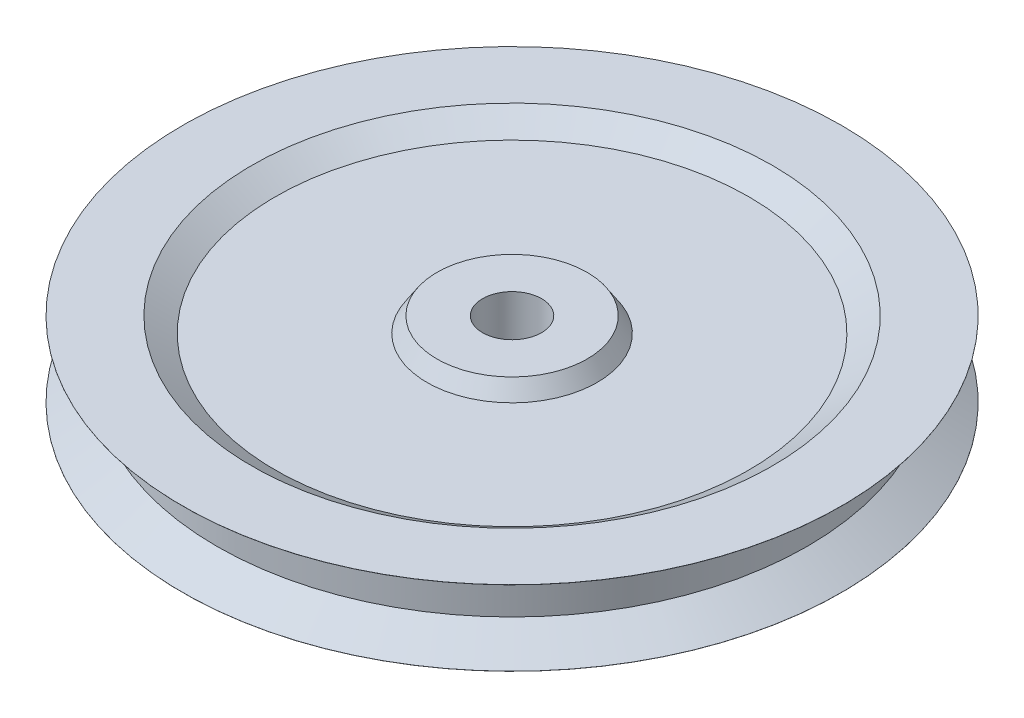
ISO-10303-21;
HEADER;
FILE_DESCRIPTION(('STEP AP214'),'2;1');
FILE_NAME('part.step','',(''),(''),'','','');
FILE_SCHEMA(('AUTOMOTIVE_DESIGN { 1 0 10303 214 1 1 1 1 }'));
ENDSEC;
DATA;
#1=APPLICATION_CONTEXT('core data for automotive mechanical design processes');
#2=APPLICATION_PROTOCOL_DEFINITION('international standard','automotive_design',2000,#1);
#3=PRODUCT_CONTEXT('',#1,'mechanical');
#4=PRODUCT('Part','Part','',(#3));
#5=PRODUCT_RELATED_PRODUCT_CATEGORY('part','',(#4));
#6=PRODUCT_DEFINITION_FORMATION('','',#4);
#7=PRODUCT_DEFINITION_CONTEXT('part definition',#1,'design');
#8=PRODUCT_DEFINITION('design','',#6,#7);
#9=PRODUCT_DEFINITION_SHAPE('','',#8);
#10=(LENGTH_UNIT() NAMED_UNIT(*) SI_UNIT(.MILLI.,.METRE.));
#11=(NAMED_UNIT(*) PLANE_ANGLE_UNIT() SI_UNIT($,.RADIAN.));
#12=(NAMED_UNIT(*) SI_UNIT($,.STERADIAN.) SOLID_ANGLE_UNIT());
#13=UNCERTAINTY_MEASURE_WITH_UNIT(LENGTH_MEASURE(1.E-05),#10,'distance_accuracy_value','');
#14=(GEOMETRIC_REPRESENTATION_CONTEXT(3) GLOBAL_UNCERTAINTY_ASSIGNED_CONTEXT((#13)) GLOBAL_UNIT_ASSIGNED_CONTEXT((#10,
#11,#12)) REPRESENTATION_CONTEXT('',''));
#15=CARTESIAN_POINT('',(0.,0.,0.));
#16=DIRECTION('',(0.,0.,1.));
#17=DIRECTION('',(1.,0.,0.));
#18=AXIS2_PLACEMENT_3D('',#15,#16,#17);
#19=CARTESIAN_POINT('',(25.4439914314799,12.7,0.));
#20=DIRECTION('',(0.,1.,0.));
#21=DIRECTION('',(0.,0.,1.));
#22=AXIS2_PLACEMENT_3D('',#19,#20,#21);
#23=PLANE('',#22);
#24=CARTESIAN_POINT('',(0.,12.7,0.));
#25=DIRECTION('',(0.,-1.,0.));
#26=DIRECTION('',(0.,0.,-1.));
#27=AXIS2_PLACEMENT_3D('',#24,#25,#26);
#28=CIRCLE('',#27,10.);
#29=CARTESIAN_POINT('',(0.,12.7,-10.));
#30=VERTEX_POINT('',#29);
#31=EDGE_CURVE('E80',#30,#30,#28,.T.);
#32=ORIENTED_EDGE('',*,*,#31,.T.);
#33=EDGE_LOOP('',(#32));
#34=FACE_BOUND('',#33,.T.);
#35=CARTESIAN_POINT('',(0.,12.7,0.));
#36=DIRECTION('',(0.,-1.,0.));
#37=DIRECTION('',(0.,0.,-1.));
#38=AXIS2_PLACEMENT_3D('',#35,#36,#37);
#39=CIRCLE('',#38,25.4439914314799);
#40=CARTESIAN_POINT('',(0.,12.7,-25.4439914314799));
#41=VERTEX_POINT('',#40);
#42=EDGE_CURVE('E10',#41,#41,#39,.T.);
#43=ORIENTED_EDGE('',*,*,#42,.F.);
#44=EDGE_LOOP('',(#43));
#45=FACE_BOUND('',#44,.T.);
#46=ADVANCED_FACE('F31',(#34,#45),#23,.T.);
#47=CARTESIAN_POINT('',(0.,7.50000000000001,0.));
#48=DIRECTION('',(0.,-1.,0.));
#49=DIRECTION('',(0.,0.,-1.));
#50=AXIS2_PLACEMENT_3D('',#47,#48,#49);
#51=CONICAL_SURFACE('',#50,28.8281496919193,0.576937170182289);
#52=ORIENTED_EDGE('',*,*,#42,.T.);
#53=EDGE_LOOP('',(#52));
#54=FACE_BOUND('',#53,.T.);
#55=CARTESIAN_POINT('',(0.,7.50000000000001,0.));
#56=DIRECTION('',(0.,-1.,0.));
#57=DIRECTION('',(0.,0.,-1.));
#58=AXIS2_PLACEMENT_3D('',#55,#56,#57);
#59=CIRCLE('',#58,28.8281496919193);
#60=CARTESIAN_POINT('',(0.,7.50000000000001,-28.8281496919193));
#61=VERTEX_POINT('',#60);
#62=EDGE_CURVE('E37',#61,#61,#59,.T.);
#63=ORIENTED_EDGE('',*,*,#62,.F.);
#64=EDGE_LOOP('',(#63));
#65=FACE_BOUND('',#64,.T.);
#66=ADVANCED_FACE('F107',(#54,#65),#51,.T.);
#67=CARTESIAN_POINT('',(80.211990775562,7.5,0.));
#68=DIRECTION('',(0.,1.,0.));
#69=DIRECTION('',(0.,0.,1.));
#70=AXIS2_PLACEMENT_3D('',#67,#68,#69);
#71=PLANE('',#70);
#72=ORIENTED_EDGE('',*,*,#62,.T.);
#73=EDGE_LOOP('',(#72));
#74=FACE_BOUND('',#73,.T.);
#75=CARTESIAN_POINT('',(0.,7.5,0.));
#76=DIRECTION('',(0.,-1.,0.));
#77=DIRECTION('',(0.,0.,-1.));
#78=AXIS2_PLACEMENT_3D('',#75,#76,#77);
#79=CIRCLE('',#78,80.211990775562);
#80=CARTESIAN_POINT('',(0.,7.5,-80.211990775562));
#81=VERTEX_POINT('',#80);
#82=EDGE_CURVE('E41',#81,#81,#79,.T.);
#83=ORIENTED_EDGE('',*,*,#82,.F.);
#84=EDGE_LOOP('',(#83));
#85=FACE_BOUND('',#84,.T.);
#86=ADVANCED_FACE('F112',(#74,#85),#71,.T.);
#87=CARTESIAN_POINT('',(0.,12.7,0.));
#88=DIRECTION('',(0.,1.,0.));
#89=DIRECTION('',(0.,0.,1.));
#90=AXIS2_PLACEMENT_3D('',#87,#88,#89);
#91=CONICAL_SURFACE('',#90,88.2021608323516,0.993859156612608);
#92=ORIENTED_EDGE('',*,*,#82,.T.);
#93=EDGE_LOOP('',(#92));
#94=FACE_BOUND('',#93,.T.);
#95=CARTESIAN_POINT('',(0.,12.7,0.));
#96=DIRECTION('',(0.,-1.,0.));
#97=DIRECTION('',(0.,0.,-1.));
#98=AXIS2_PLACEMENT_3D('',#95,#96,#97);
#99=CIRCLE('',#98,88.2021608323516);
#100=CARTESIAN_POINT('',(0.,12.7,-88.2021608323516));
#101=VERTEX_POINT('',#100);
#102=EDGE_CURVE('E45',#101,#101,#99,.T.);
#103=ORIENTED_EDGE('',*,*,#102,.F.);
#104=EDGE_LOOP('',(#103));
#105=FACE_BOUND('',#104,.T.);
#106=ADVANCED_FACE('F118',(#94,#105),#91,.F.);
#107=CARTESIAN_POINT('',(111.650373599573,12.7,0.));
#108=DIRECTION('',(0.,1.,0.));
#109=DIRECTION('',(0.,0.,1.));
#110=AXIS2_PLACEMENT_3D('',#107,#108,#109);
#111=PLANE('',#110);
#112=ORIENTED_EDGE('',*,*,#102,.T.);
#113=EDGE_LOOP('',(#112));
#114=FACE_BOUND('',#113,.T.);
#115=CARTESIAN_POINT('',(0.,12.7,0.));
#116=DIRECTION('',(0.,-1.,0.));
#117=DIRECTION('',(0.,0.,-1.));
#118=AXIS2_PLACEMENT_3D('',#115,#116,#117);
#119=CIRCLE('',#118,111.650373599573);
#120=CARTESIAN_POINT('',(0.,12.7,-111.650373599573));
#121=VERTEX_POINT('',#120);
#122=EDGE_CURVE('E50',#121,#121,#119,.T.);
#123=ORIENTED_EDGE('',*,*,#122,.F.);
#124=EDGE_LOOP('',(#123));
#125=FACE_BOUND('',#124,.T.);
#126=ADVANCED_FACE('F124',(#114,#125),#111,.T.);
#127=CARTESIAN_POINT('',(0.,-23.8365082922438,0.));
#128=DIRECTION('',(0.,-1.,0.));
#129=DIRECTION('',(0.,0.,-1.));
#130=AXIS2_PLACEMENT_3D('',#127,#128,#129);
#131=CYLINDRICAL_SURFACE('',#130,111.650373599573);
#132=ORIENTED_EDGE('',*,*,#122,.T.);
#133=EDGE_LOOP('',(#132));
#134=FACE_BOUND('',#133,.T.);
#135=CARTESIAN_POINT('',(0.,12.6708412473203,0.));
#136=DIRECTION('',(0.,-1.,0.));
#137=DIRECTION('',(0.,0.,-1.));
#138=AXIS2_PLACEMENT_3D('',#135,#136,#137);
#139=CIRCLE('',#138,111.650373599573);
#140=CARTESIAN_POINT('',(0.,12.6708412473203,-111.650373599573));
#141=VERTEX_POINT('',#140);
#142=EDGE_CURVE('E53',#141,#141,#139,.T.);
#143=ORIENTED_EDGE('',*,*,#142,.F.);
#144=EDGE_LOOP('',(#143));
#145=FACE_BOUND('',#144,.T.);
#146=ADVANCED_FACE('F128',(#134,#145),#131,.T.);
#147=CARTESIAN_POINT('',(0.,5.,0.));
#148=DIRECTION('',(0.,1.,0.));
#149=DIRECTION('',(0.,0.,1.));
#150=AXIS2_PLACEMENT_3D('',#147,#148,#149);
#151=CONICAL_SURFACE('',#150,100.,0.988524569073561);
#152=ORIENTED_EDGE('',*,*,#142,.T.);
#153=EDGE_LOOP('',(#152));
#154=FACE_BOUND('',#153,.T.);
#155=CARTESIAN_POINT('',(0.,5.,0.));
#156=DIRECTION('',(0.,-1.,0.));
#157=DIRECTION('',(0.,0.,-1.));
#158=AXIS2_PLACEMENT_3D('',#155,#156,#157);
#159=CIRCLE('',#158,100.);
#160=CARTESIAN_POINT('',(0.,5.,-100.));
#161=VERTEX_POINT('',#160);
#162=EDGE_CURVE('E56',#161,#161,#159,.T.);
#163=ORIENTED_EDGE('',*,*,#162,.F.);
#164=EDGE_LOOP('',(#163));
#165=FACE_BOUND('',#164,.T.);
#166=ADVANCED_FACE('F132',(#154,#165),#151,.T.);
#167=CARTESIAN_POINT('',(0.,-23.8365082922438,0.));
#168=DIRECTION('',(0.,-1.,0.));
#169=DIRECTION('',(0.,0.,-1.));
#170=AXIS2_PLACEMENT_3D('',#167,#168,#169);
#171=CYLINDRICAL_SURFACE('',#170,100.);
#172=ORIENTED_EDGE('',*,*,#162,.T.);
#173=EDGE_LOOP('',(#172));
#174=FACE_BOUND('',#173,.T.);
#175=CARTESIAN_POINT('',(0.,-5.,0.));
#176=DIRECTION('',(0.,-1.,0.));
#177=DIRECTION('',(0.,0.,-1.));
#178=AXIS2_PLACEMENT_3D('',#175,#176,#177);
#179=CIRCLE('',#178,100.);
#180=CARTESIAN_POINT('',(0.,-5.,-100.));
#181=VERTEX_POINT('',#180);
#182=EDGE_CURVE('E59',#181,#181,#179,.T.);
#183=ORIENTED_EDGE('',*,*,#182,.F.);
#184=EDGE_LOOP('',(#183));
#185=FACE_BOUND('',#184,.T.);
#186=ADVANCED_FACE('F136',(#174,#185),#171,.T.);
#187=CARTESIAN_POINT('',(0.,-12.6708412473203,0.));
#188=DIRECTION('',(0.,-1.,0.));
#189=DIRECTION('',(0.,0.,-1.));
#190=AXIS2_PLACEMENT_3D('',#187,#188,#189);
#191=CONICAL_SURFACE('',#190,111.650373599573,0.988524569073561);
#192=ORIENTED_EDGE('',*,*,#182,.T.);
#193=EDGE_LOOP('',(#192));
#194=FACE_BOUND('',#193,.T.);
#195=CARTESIAN_POINT('',(0.,-12.6708412473203,0.));
#196=DIRECTION('',(0.,-1.,0.));
#197=DIRECTION('',(0.,0.,-1.));
#198=AXIS2_PLACEMENT_3D('',#195,#196,#197);
#199=CIRCLE('',#198,111.650373599573);
#200=CARTESIAN_POINT('',(0.,-12.6708412473203,-111.650373599573));
#201=VERTEX_POINT('',#200);
#202=EDGE_CURVE('E62',#201,#201,#199,.T.);
#203=ORIENTED_EDGE('',*,*,#202,.F.);
#204=EDGE_LOOP('',(#203));
#205=FACE_BOUND('',#204,.T.);
#206=ADVANCED_FACE('F140',(#194,#205),#191,.T.);
#207=CARTESIAN_POINT('',(0.,-23.8365082922438,0.));
#208=DIRECTION('',(0.,-1.,0.));
#209=DIRECTION('',(0.,0.,-1.));
#210=AXIS2_PLACEMENT_3D('',#207,#208,#209);
#211=CYLINDRICAL_SURFACE('',#210,111.650373599573);
#212=ORIENTED_EDGE('',*,*,#202,.T.);
#213=EDGE_LOOP('',(#212));
#214=FACE_BOUND('',#213,.T.);
#215=CARTESIAN_POINT('',(0.,-12.7,0.));
#216=DIRECTION('',(0.,-1.,0.));
#217=DIRECTION('',(0.,0.,-1.));
#218=AXIS2_PLACEMENT_3D('',#215,#216,#217);
#219=CIRCLE('',#218,111.650373599573);
#220=CARTESIAN_POINT('',(0.,-12.7,-111.650373599573));
#221=VERTEX_POINT('',#220);
#222=EDGE_CURVE('E65',#221,#221,#219,.T.);
#223=ORIENTED_EDGE('',*,*,#222,.F.);
#224=EDGE_LOOP('',(#223));
#225=FACE_BOUND('',#224,.T.);
#226=ADVANCED_FACE('F144',(#214,#225),#211,.T.);
#227=CARTESIAN_POINT('',(111.650373599573,-12.7,0.));
#228=DIRECTION('',(0.,-1.,0.));
#229=DIRECTION('',(0.,0.,-1.));
#230=AXIS2_PLACEMENT_3D('',#227,#228,#229);
#231=PLANE('',#230);
#232=ORIENTED_EDGE('',*,*,#222,.T.);
#233=EDGE_LOOP('',(#232));
#234=FACE_BOUND('',#233,.T.);
#235=CARTESIAN_POINT('',(0.,-12.7,0.));
#236=DIRECTION('',(0.,-1.,0.));
#237=DIRECTION('',(0.,0.,-1.));
#238=AXIS2_PLACEMENT_3D('',#235,#236,#237);
#239=CIRCLE('',#238,88.2021608323516);
#240=CARTESIAN_POINT('',(0.,-12.7,-88.2021608323516));
#241=VERTEX_POINT('',#240);
#242=EDGE_CURVE('E68',#241,#241,#239,.T.);
#243=ORIENTED_EDGE('',*,*,#242,.F.);
#244=EDGE_LOOP('',(#243));
#245=FACE_BOUND('',#244,.T.);
#246=ADVANCED_FACE('F148',(#234,#245),#231,.T.);
#247=CARTESIAN_POINT('',(0.,-7.5,0.));
#248=DIRECTION('',(0.,-1.,0.));
#249=DIRECTION('',(0.,0.,-1.));
#250=AXIS2_PLACEMENT_3D('',#247,#248,#249);
#251=CONICAL_SURFACE('',#250,80.211990775562,0.993859156612608);
#252=ORIENTED_EDGE('',*,*,#242,.T.);
#253=EDGE_LOOP('',(#252));
#254=FACE_BOUND('',#253,.T.);
#255=CARTESIAN_POINT('',(0.,-7.5,0.));
#256=DIRECTION('',(0.,-1.,0.));
#257=DIRECTION('',(0.,0.,-1.));
#258=AXIS2_PLACEMENT_3D('',#255,#256,#257);
#259=CIRCLE('',#258,80.211990775562);
#260=CARTESIAN_POINT('',(0.,-7.5,-80.211990775562));
#261=VERTEX_POINT('',#260);
#262=EDGE_CURVE('E71',#261,#261,#259,.T.);
#263=ORIENTED_EDGE('',*,*,#262,.F.);
#264=EDGE_LOOP('',(#263));
#265=FACE_BOUND('',#264,.T.);
#266=ADVANCED_FACE('F152',(#254,#265),#251,.F.);
#267=CARTESIAN_POINT('',(80.211990775562,-7.5,0.));
#268=DIRECTION('',(0.,-1.,0.));
#269=DIRECTION('',(0.,0.,-1.));
#270=AXIS2_PLACEMENT_3D('',#267,#268,#269);
#271=PLANE('',#270);
#272=ORIENTED_EDGE('',*,*,#262,.T.);
#273=EDGE_LOOP('',(#272));
#274=FACE_BOUND('',#273,.T.);
#275=CARTESIAN_POINT('',(0.,-7.50000000000001,0.));
#276=DIRECTION('',(0.,-1.,0.));
#277=DIRECTION('',(0.,0.,-1.));
#278=AXIS2_PLACEMENT_3D('',#275,#276,#277);
#279=CIRCLE('',#278,28.8281496919193);
#280=CARTESIAN_POINT('',(0.,-7.50000000000001,-28.8281496919193));
#281=VERTEX_POINT('',#280);
#282=EDGE_CURVE('E74',#281,#281,#279,.T.);
#283=ORIENTED_EDGE('',*,*,#282,.F.);
#284=EDGE_LOOP('',(#283));
#285=FACE_BOUND('',#284,.T.);
#286=ADVANCED_FACE('F156',(#274,#285),#271,.T.);
#287=CARTESIAN_POINT('',(0.,-12.7,0.));
#288=DIRECTION('',(0.,1.,0.));
#289=DIRECTION('',(0.,0.,1.));
#290=AXIS2_PLACEMENT_3D('',#287,#288,#289);
#291=CONICAL_SURFACE('',#290,25.4439914314799,0.576937170182289);
#292=ORIENTED_EDGE('',*,*,#282,.T.);
#293=EDGE_LOOP('',(#292));
#294=FACE_BOUND('',#293,.T.);
#295=CARTESIAN_POINT('',(0.,-12.7,0.));
#296=DIRECTION('',(0.,-1.,0.));
#297=DIRECTION('',(0.,0.,-1.));
#298=AXIS2_PLACEMENT_3D('',#295,#296,#297);
#299=CIRCLE('',#298,25.4439914314799);
#300=CARTESIAN_POINT('',(0.,-12.7,-25.4439914314799));
#301=VERTEX_POINT('',#300);
#302=EDGE_CURVE('E77',#301,#301,#299,.T.);
#303=ORIENTED_EDGE('',*,*,#302,.F.);
#304=EDGE_LOOP('',(#303));
#305=FACE_BOUND('',#304,.T.);
#306=ADVANCED_FACE('F103',(#294,#305),#291,.T.);
#307=CARTESIAN_POINT('',(0.,-23.8365082922438,0.));
#308=DIRECTION('',(0.,-1.,0.));
#309=DIRECTION('',(0.,0.,-1.));
#310=AXIS2_PLACEMENT_3D('',#307,#308,#309);
#311=CYLINDRICAL_SURFACE('',#310,10.);
#312=ORIENTED_EDGE('',*,*,#31,.F.);
#313=EDGE_LOOP('',(#312));
#314=FACE_BOUND('',#313,.T.);
#315=CARTESIAN_POINT('',(0.,-32.7,0.));
#316=DIRECTION('',(0.,-1.,0.));
#317=DIRECTION('',(0.,0.,-1.));
#318=AXIS2_PLACEMENT_3D('',#315,#316,#317);
#319=CIRCLE('',#318,10.);
#320=CARTESIAN_POINT('',(0.,-32.7,-10.));
#321=VERTEX_POINT('',#320);
#322=EDGE_CURVE('E86',#321,#321,#319,.T.);
#323=ORIENTED_EDGE('',*,*,#322,.T.);
#324=EDGE_LOOP('',(#323));
#325=FACE_BOUND('',#324,.T.);
#326=ADVANCED_FACE('F90',(#314,#325),#311,.F.);
#327=CARTESIAN_POINT('',(0.,-32.7,0.));
#328=DIRECTION('',(0.,-1.,0.));
#329=DIRECTION('',(0.,0.,-1.));
#330=AXIS2_PLACEMENT_3D('',#327,#328,#329);
#331=PLANE('',#330);
#332=CARTESIAN_POINT('',(0.,-32.7,0.));
#333=DIRECTION('',(0.,-1.,0.));
#334=DIRECTION('',(0.,0.,-1.));
#335=AXIS2_PLACEMENT_3D('',#332,#333,#334);
#336=CIRCLE('',#335,25.4439914314799);
#337=CARTESIAN_POINT('',(0.,-32.7,-25.4439914314799));
#338=VERTEX_POINT('',#337);
#339=EDGE_CURVE('E83',#338,#338,#336,.T.);
#340=ORIENTED_EDGE('',*,*,#339,.T.);
#341=EDGE_LOOP('',(#340));
#342=FACE_BOUND('',#341,.T.);
#343=ORIENTED_EDGE('',*,*,#322,.F.);
#344=EDGE_LOOP('',(#343));
#345=FACE_BOUND('',#344,.T.);
#346=ADVANCED_FACE('F92',(#342,#345),#331,.T.);
#347=CARTESIAN_POINT('',(0.,-32.7,0.));
#348=DIRECTION('',(0.,1.,0.));
#349=DIRECTION('',(0.,0.,1.));
#350=AXIS2_PLACEMENT_3D('',#347,#348,#349);
#351=CYLINDRICAL_SURFACE('',#350,25.4439914314799);
#352=ORIENTED_EDGE('',*,*,#339,.F.);
#353=EDGE_LOOP('',(#352));
#354=FACE_BOUND('',#353,.T.);
#355=ORIENTED_EDGE('',*,*,#302,.T.);
#356=EDGE_LOOP('',(#355));
#357=FACE_BOUND('',#356,.T.);
#358=ADVANCED_FACE('F94',(#354,#357),#351,.T.);
#359=CLOSED_SHELL('',(#46,#66,#86,#106,#126,#146,#166,#186,#206,#226,#246,#266,#286,#306,#326,
#346,#358));
#360=MANIFOLD_SOLID_BREP('B2',#359);
#361=ADVANCED_BREP_SHAPE_REPRESENTATION('',(#18,#360),#14);
#362=SHAPE_DEFINITION_REPRESENTATION(#9,#361);
ENDSEC;
END-ISO-10303-21;
